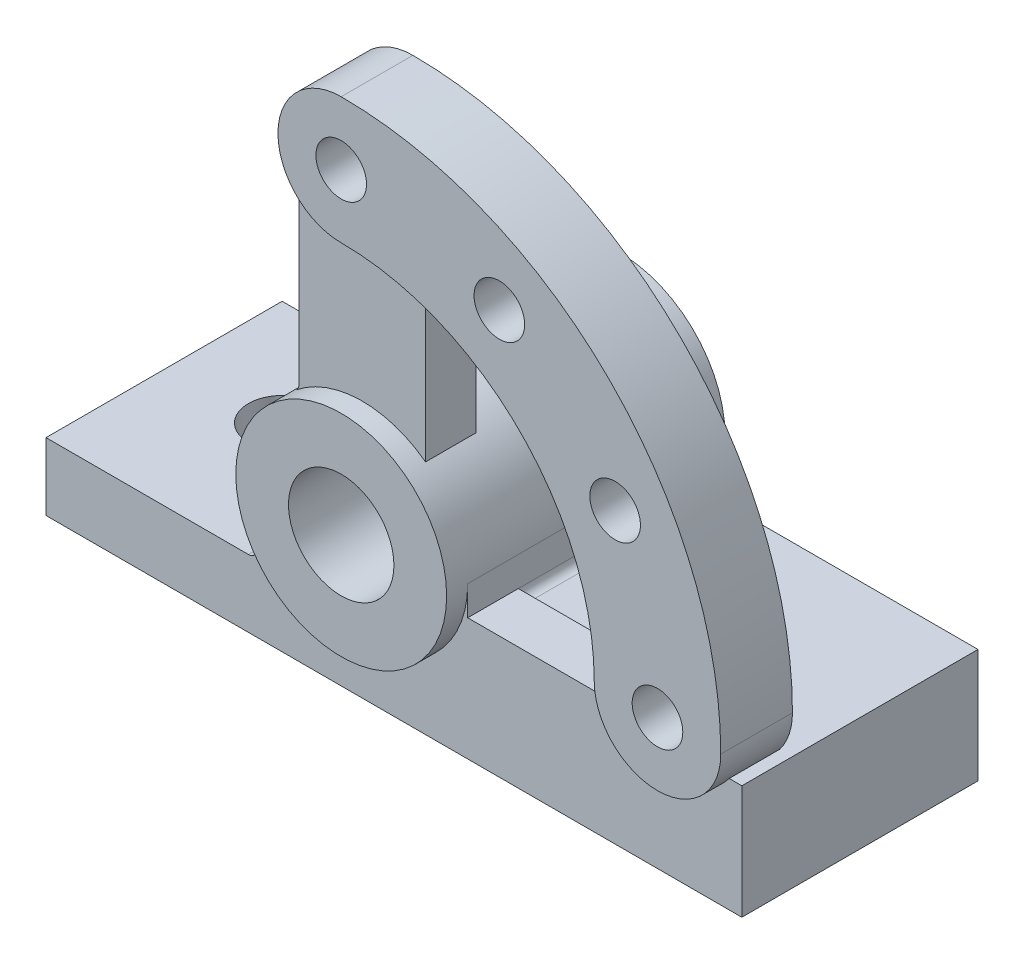
ISO-10303-21;
HEADER;
FILE_DESCRIPTION(('STEP AP214'),'2;1');
FILE_NAME('part.step','',(''),(''),'','','');
FILE_SCHEMA(('AUTOMOTIVE_DESIGN { 1 0 10303 214 1 1 1 1 }'));
ENDSEC;
DATA;
#1=APPLICATION_CONTEXT('core data for automotive mechanical design processes');
#2=APPLICATION_PROTOCOL_DEFINITION('international standard','automotive_design',2000,#1);
#3=PRODUCT_CONTEXT('',#1,'mechanical');
#4=PRODUCT('Part','Part','',(#3));
#5=PRODUCT_RELATED_PRODUCT_CATEGORY('part','',(#4));
#6=PRODUCT_DEFINITION_FORMATION('','',#4);
#7=PRODUCT_DEFINITION_CONTEXT('part definition',#1,'design');
#8=PRODUCT_DEFINITION('design','',#6,#7);
#9=PRODUCT_DEFINITION_SHAPE('','',#8);
#10=(LENGTH_UNIT() NAMED_UNIT(*) SI_UNIT(.MILLI.,.METRE.));
#11=(NAMED_UNIT(*) PLANE_ANGLE_UNIT() SI_UNIT($,.RADIAN.));
#12=(NAMED_UNIT(*) SI_UNIT($,.STERADIAN.) SOLID_ANGLE_UNIT());
#13=UNCERTAINTY_MEASURE_WITH_UNIT(LENGTH_MEASURE(1.E-05),#10,'distance_accuracy_value','');
#14=(GEOMETRIC_REPRESENTATION_CONTEXT(3) GLOBAL_UNCERTAINTY_ASSIGNED_CONTEXT((#13)) GLOBAL_UNIT_ASSIGNED_CONTEXT((#10,
#11,#12)) REPRESENTATION_CONTEXT('',''));
#15=CARTESIAN_POINT('',(0.,0.,0.));
#16=DIRECTION('',(0.,0.,1.));
#17=DIRECTION('',(1.,0.,0.));
#18=AXIS2_PLACEMENT_3D('',#15,#16,#17);
#19=CARTESIAN_POINT('',(27.,-7.00000000000001,-28.));
#20=DIRECTION('',(0.,0.,1.));
#21=DIRECTION('',(1.,0.,0.));
#22=AXIS2_PLACEMENT_3D('',#19,#20,#21);
#23=CYLINDRICAL_SURFACE('',#22,2.);
#24=CARTESIAN_POINT('',(27.,-7.00000000000001,16.));
#25=DIRECTION('',(0.,0.,1.));
#26=DIRECTION('',(1.,0.,0.));
#27=AXIS2_PLACEMENT_3D('',#24,#25,#26);
#28=CIRCLE('',#27,2.);
#29=CARTESIAN_POINT('',(25.,-7.00000000000002,16.));
#30=VERTEX_POINT('',#29);
#31=CARTESIAN_POINT('',(27.,-9.00000000000001,16.));
#32=VERTEX_POINT('',#31);
#33=EDGE_CURVE('E230',#30,#32,#28,.T.);
#34=ORIENTED_EDGE('',*,*,#33,.T.);
#35=DIRECTION('',(0.,0.,1.));
#36=VECTOR('',#35,1.);
#37=CARTESIAN_POINT('',(27.,-9.00000000000001,-28.));
#38=LINE('',#37,#36);
#39=CARTESIAN_POINT('',(27.,-9.00000000000001,-28.));
#40=VERTEX_POINT('',#39);
#41=EDGE_CURVE('E246',#40,#32,#38,.T.);
#42=ORIENTED_EDGE('',*,*,#41,.F.);
#43=CARTESIAN_POINT('',(27.,-7.00000000000001,-28.));
#44=DIRECTION('',(0.,0.,1.));
#45=DIRECTION('',(1.,0.,0.));
#46=AXIS2_PLACEMENT_3D('',#43,#44,#45);
#47=CIRCLE('',#46,2.);
#48=CARTESIAN_POINT('',(25.,-7.,-28.));
#49=VERTEX_POINT('',#48);
#50=EDGE_CURVE('E454',#49,#40,#47,.T.);
#51=ORIENTED_EDGE('',*,*,#50,.F.);
#52=DIRECTION('',(0.,0.,1.));
#53=VECTOR('',#52,1.);
#54=CARTESIAN_POINT('',(25.,-7.,-28.));
#55=LINE('',#54,#53);
#56=EDGE_CURVE('E249',#49,#30,#55,.T.);
#57=ORIENTED_EDGE('',*,*,#56,.T.);
#58=EDGE_LOOP('',(#34,#42,#51,#57));
#59=FACE_BOUND('',#58,.T.);
#60=ADVANCED_FACE('F70',(#59),#23,.F.);
#61=CARTESIAN_POINT('',(27.,-9.00000000000001,-28.));
#62=DIRECTION('',(0.,-1.,0.));
#63=DIRECTION('',(0.,0.,-1.));
#64=AXIS2_PLACEMENT_3D('',#61,#62,#63);
#65=PLANE('',#64);
#66=CARTESIAN_POINT('',(57.5,-9.00000000000001,-3.));
#67=DIRECTION('',(0.,1.,0.));
#68=DIRECTION('',(0.,0.,1.));
#69=AXIS2_PLACEMENT_3D('',#66,#67,#68);
#70=CIRCLE('',#69,8.00000000000001);
#71=CARTESIAN_POINT('',(57.5,-9.00000000000001,5.00000000000001));
#72=VERTEX_POINT('',#71);
#73=EDGE_CURVE('E537',#72,#72,#70,.T.);
#74=ORIENTED_EDGE('',*,*,#73,.F.);
#75=EDGE_LOOP('',(#74));
#76=FACE_BOUND('',#75,.T.);
#77=ORIENTED_EDGE('',*,*,#41,.T.);
#78=DIRECTION('',(-1.,0.,0.));
#79=VECTOR('',#78,1.);
#80=CARTESIAN_POINT('',(27.,-9.00000000000001,16.));
#81=LINE('',#80,#79);
#82=CARTESIAN_POINT('',(87.,-9.00000000000001,16.));
#83=VERTEX_POINT('',#82);
#84=EDGE_CURVE('E224',#83,#32,#81,.T.);
#85=ORIENTED_EDGE('',*,*,#84,.F.);
#86=DIRECTION('',(0.,0.,1.));
#87=VECTOR('',#86,1.);
#88=CARTESIAN_POINT('',(87.,-9.00000000000001,16.));
#89=LINE('',#88,#87);
#90=CARTESIAN_POINT('',(87.,-9.00000000000001,28.));
#91=VERTEX_POINT('',#90);
#92=EDGE_CURVE('E411',#83,#91,#89,.T.);
#93=ORIENTED_EDGE('',*,*,#92,.T.);
#94=DIRECTION('',(1.,0.,0.));
#95=VECTOR('',#94,1.);
#96=CARTESIAN_POINT('',(27.,-9.00000000000001,28.));
#97=LINE('',#96,#95);
#98=CARTESIAN_POINT('',(90.,-9.00000000000001,28.));
#99=VERTEX_POINT('',#98);
#100=EDGE_CURVE('E484',#91,#99,#97,.T.);
#101=ORIENTED_EDGE('',*,*,#100,.T.);
#102=DIRECTION('',(0.,0.,1.));
#103=VECTOR('',#102,1.);
#104=CARTESIAN_POINT('',(90.,-9.00000000000001,-28.));
#105=LINE('',#104,#103);
#106=CARTESIAN_POINT('',(90.,-9.00000000000001,-28.));
#107=VERTEX_POINT('',#106);
#108=EDGE_CURVE('E258',#107,#99,#105,.T.);
#109=ORIENTED_EDGE('',*,*,#108,.F.);
#110=DIRECTION('',(1.,0.,0.));
#111=VECTOR('',#110,1.);
#112=CARTESIAN_POINT('',(27.,-9.00000000000001,-28.));
#113=LINE('',#112,#111);
#114=EDGE_CURVE('E256',#40,#107,#113,.T.);
#115=ORIENTED_EDGE('',*,*,#114,.F.);
#116=EDGE_LOOP('',(#77,#85,#93,#101,#109,#115));
#117=FACE_BOUND('',#116,.T.);
#118=ADVANCED_FACE('F254',(#76,#117),#65,.F.);
#119=CARTESIAN_POINT('',(0.,0.,33.));
#120=DIRECTION('',(0.,0.,-1.));
#121=DIRECTION('',(-1.,0.,0.));
#122=AXIS2_PLACEMENT_3D('',#119,#120,#121);
#123=CYLINDRICAL_SURFACE('',#122,25.);
#124=CARTESIAN_POINT('',(0.,0.,28.));
#125=DIRECTION('',(0.,0.,-1.));
#126=DIRECTION('',(1.,0.,0.));
#127=AXIS2_PLACEMENT_3D('',#124,#125,#126);
#128=CIRCLE('',#127,25.);
#129=CARTESIAN_POINT('',(-15.7407407407407,19.422386077225,28.));
#130=VERTEX_POINT('',#129);
#131=CARTESIAN_POINT('',(15.,20.,28.));
#132=VERTEX_POINT('',#131);
#133=EDGE_CURVE('E86',#130,#132,#128,.T.);
#134=ORIENTED_EDGE('',*,*,#133,.F.);
#135=DIRECTION('',(0.,0.,-1.));
#136=VECTOR('',#135,1.);
#137=CARTESIAN_POINT('',(-15.7407407407407,19.422386077225,33.));
#138=LINE('',#137,#136);
#139=CARTESIAN_POINT('',(-15.7407407407407,19.422386077225,16.));
#140=VERTEX_POINT('',#139);
#141=EDGE_CURVE('E352',#130,#140,#138,.T.);
#142=ORIENTED_EDGE('',*,*,#141,.T.);
#143=CARTESIAN_POINT('',(0.,0.,16.));
#144=DIRECTION('',(0.,0.,-1.));
#145=DIRECTION('',(1.,0.,0.));
#146=AXIS2_PLACEMENT_3D('',#143,#144,#145);
#147=CIRCLE('',#146,25.);
#148=CARTESIAN_POINT('',(15.,20.,16.));
#149=VERTEX_POINT('',#148);
#150=EDGE_CURVE('E93',#140,#149,#147,.T.);
#151=ORIENTED_EDGE('',*,*,#150,.T.);
#152=DIRECTION('',(0.,0.,1.));
#153=VECTOR('',#152,1.);
#154=CARTESIAN_POINT('',(15.,20.,16.));
#155=LINE('',#154,#153);
#156=EDGE_CURVE('E297',#149,#132,#155,.T.);
#157=ORIENTED_EDGE('',*,*,#156,.T.);
#158=EDGE_LOOP('',(#134,#142,#151,#157));
#159=FACE_BOUND('',#158,.T.);
#160=CARTESIAN_POINT('',(0.,0.,33.));
#161=DIRECTION('',(0.,0.,1.));
#162=DIRECTION('',(1.,0.,0.));
#163=AXIS2_PLACEMENT_3D('',#160,#161,#162);
#164=CIRCLE('',#163,25.);
#165=CARTESIAN_POINT('',(25.,0.,33.));
#166=VERTEX_POINT('',#165);
#167=EDGE_CURVE('E339',#166,#166,#164,.T.);
#168=ORIENTED_EDGE('',*,*,#167,.F.);
#169=EDGE_LOOP('',(#168));
#170=FACE_BOUND('',#169,.T.);
#171=CARTESIAN_POINT('',(0.,0.,-33.));
#172=DIRECTION('',(0.,0.,1.));
#173=DIRECTION('',(1.,0.,0.));
#174=AXIS2_PLACEMENT_3D('',#171,#172,#173);
#175=CIRCLE('',#174,25.);
#176=CARTESIAN_POINT('',(25.,0.,-33.));
#177=VERTEX_POINT('',#176);
#178=EDGE_CURVE('E335',#177,#177,#175,.T.);
#179=ORIENTED_EDGE('',*,*,#178,.T.);
#180=EDGE_LOOP('',(#179));
#181=FACE_BOUND('',#180,.T.);
#182=CARTESIAN_POINT('',(0.,0.,-28.));
#183=DIRECTION('',(0.,0.,1.));
#184=DIRECTION('',(1.,0.,0.));
#185=AXIS2_PLACEMENT_3D('',#182,#183,#184);
#186=CIRCLE('',#185,25.);
#187=CARTESIAN_POINT('',(-25.,0.,-28.));
#188=VERTEX_POINT('',#187);
#189=CARTESIAN_POINT('',(25.,0.,-28.));
#190=VERTEX_POINT('',#189);
#191=EDGE_CURVE('E448',#188,#190,#186,.T.);
#192=ORIENTED_EDGE('',*,*,#191,.F.);
#193=DIRECTION('',(0.,0.,1.));
#194=VECTOR('',#193,1.);
#195=CARTESIAN_POINT('',(-25.,0.,-28.));
#196=LINE('',#195,#194);
#197=CARTESIAN_POINT('',(-25.,0.,28.));
#198=VERTEX_POINT('',#197);
#199=EDGE_CURVE('E272',#188,#198,#196,.T.);
#200=ORIENTED_EDGE('',*,*,#199,.T.);
#201=CARTESIAN_POINT('',(0.,0.,28.));
#202=DIRECTION('',(0.,0.,1.));
#203=DIRECTION('',(1.,0.,0.));
#204=AXIS2_PLACEMENT_3D('',#201,#202,#203);
#205=CIRCLE('',#204,25.);
#206=CARTESIAN_POINT('',(25.,0.,28.));
#207=VERTEX_POINT('',#206);
#208=EDGE_CURVE('E476',#198,#207,#205,.T.);
#209=ORIENTED_EDGE('',*,*,#208,.T.);
#210=DIRECTION('',(0.,0.,1.));
#211=VECTOR('',#210,1.);
#212=CARTESIAN_POINT('',(25.,0.,-28.));
#213=LINE('',#212,#211);
#214=EDGE_CURVE('E262',#190,#207,#213,.T.);
#215=ORIENTED_EDGE('',*,*,#214,.F.);
#216=EDGE_LOOP('',(#192,#200,#209,#215));
#217=FACE_BOUND('',#216,.T.);
#218=ADVANCED_FACE('F363',(#159,#170,#181,#217),#123,.T.);
#219=CARTESIAN_POINT('',(0.,0.,33.));
#220=DIRECTION('',(0.,0.,1.));
#221=DIRECTION('',(1.,0.,0.));
#222=AXIS2_PLACEMENT_3D('',#219,#220,#221);
#223=PLANE('',#222);
#224=ORIENTED_EDGE('',*,*,#167,.T.);
#225=EDGE_LOOP('',(#224));
#226=FACE_BOUND('',#225,.T.);
#227=CARTESIAN_POINT('',(0.,0.,33.));
#228=DIRECTION('',(0.,0.,1.));
#229=DIRECTION('',(1.,0.,0.));
#230=AXIS2_PLACEMENT_3D('',#227,#228,#229);
#231=CIRCLE('',#230,12.5);
#232=CARTESIAN_POINT('',(12.5,0.,33.));
#233=VERTEX_POINT('',#232);
#234=EDGE_CURVE('E331',#233,#233,#231,.T.);
#235=ORIENTED_EDGE('',*,*,#234,.F.);
#236=EDGE_LOOP('',(#235));
#237=FACE_BOUND('',#236,.T.);
#238=ADVANCED_FACE('F658',(#226,#237),#223,.T.);
#239=CARTESIAN_POINT('',(0.,0.,-33.));
#240=DIRECTION('',(0.,0.,1.));
#241=DIRECTION('',(1.,0.,0.));
#242=AXIS2_PLACEMENT_3D('',#239,#240,#241);
#243=PLANE('',#242);
#244=ORIENTED_EDGE('',*,*,#178,.F.);
#245=EDGE_LOOP('',(#244));
#246=FACE_BOUND('',#245,.T.);
#247=CARTESIAN_POINT('',(0.,0.,-33.));
#248=DIRECTION('',(0.,0.,1.));
#249=DIRECTION('',(1.,0.,0.));
#250=AXIS2_PLACEMENT_3D('',#247,#248,#249);
#251=CIRCLE('',#250,12.5);
#252=CARTESIAN_POINT('',(12.5,0.,-33.));
#253=VERTEX_POINT('',#252);
#254=EDGE_CURVE('E322',#253,#253,#251,.T.);
#255=ORIENTED_EDGE('',*,*,#254,.T.);
#256=EDGE_LOOP('',(#255));
#257=FACE_BOUND('',#256,.T.);
#258=ADVANCED_FACE('F656',(#246,#257),#243,.F.);
#259=CARTESIAN_POINT('',(0.,0.,33.));
#260=DIRECTION('',(0.,0.,-1.));
#261=DIRECTION('',(-1.,0.,0.));
#262=AXIS2_PLACEMENT_3D('',#259,#260,#261);
#263=CYLINDRICAL_SURFACE('',#262,12.5);
#264=ORIENTED_EDGE('',*,*,#234,.T.);
#265=EDGE_LOOP('',(#264));
#266=FACE_BOUND('',#265,.T.);
#267=ORIENTED_EDGE('',*,*,#254,.F.);
#268=EDGE_LOOP('',(#267));
#269=FACE_BOUND('',#268,.T.);
#270=ADVANCED_FACE('F650',(#266,#269),#263,.F.);
#271=CARTESIAN_POINT('',(15.,58.0947501931113,16.));
#272=DIRECTION('',(1.,0.,0.));
#273=DIRECTION('',(0.,0.,-1.));
#274=AXIS2_PLACEMENT_3D('',#271,#272,#273);
#275=PLANE('',#274);
#276=DIRECTION('',(0.,1.,0.));
#277=VECTOR('',#276,1.);
#278=CARTESIAN_POINT('',(15.,58.0947501931113,28.));
#279=LINE('',#278,#277);
#280=CARTESIAN_POINT('',(15.,58.0947501931113,28.));
#281=VERTEX_POINT('',#280);
#282=EDGE_CURVE('E303',#132,#281,#279,.T.);
#283=ORIENTED_EDGE('',*,*,#282,.F.);
#284=ORIENTED_EDGE('',*,*,#156,.F.);
#285=DIRECTION('',(0.,1.,0.));
#286=VECTOR('',#285,1.);
#287=CARTESIAN_POINT('',(15.,58.0947501931113,16.));
#288=LINE('',#287,#286);
#289=CARTESIAN_POINT('',(15.,58.0947501931113,16.));
#290=VERTEX_POINT('',#289);
#291=EDGE_CURVE('E296',#149,#290,#288,.T.);
#292=ORIENTED_EDGE('',*,*,#291,.T.);
#293=DIRECTION('',(0.,0.,1.));
#294=VECTOR('',#293,1.);
#295=CARTESIAN_POINT('',(15.,58.0947501931113,16.));
#296=LINE('',#295,#294);
#297=EDGE_CURVE('E292',#290,#281,#296,.T.);
#298=ORIENTED_EDGE('',*,*,#297,.T.);
#299=EDGE_LOOP('',(#283,#284,#292,#298));
#300=FACE_BOUND('',#299,.T.);
#301=ADVANCED_FACE('F366',(#300),#275,.T.);
#302=CARTESIAN_POINT('',(-15.,75.,16.));
#303=DIRECTION('',(-1.,0.,0.));
#304=DIRECTION('',(0.,-1.,0.));
#305=AXIS2_PLACEMENT_3D('',#302,#303,#304);
#306=PLANE('',#305);
#307=DIRECTION('',(0.,-1.,0.));
#308=VECTOR('',#307,1.);
#309=CARTESIAN_POINT('',(-15.,75.,16.));
#310=LINE('',#309,#308);
#311=CARTESIAN_POINT('',(-15.,75.,16.));
#312=VERTEX_POINT('',#311);
#313=CARTESIAN_POINT('',(-15.,20.976176963403,16.));
#314=VERTEX_POINT('',#313);
#315=EDGE_CURVE('E307',#312,#314,#310,.T.);
#316=ORIENTED_EDGE('',*,*,#315,.T.);
#317=DIRECTION('',(0.,0.,-1.));
#318=VECTOR('',#317,1.);
#319=CARTESIAN_POINT('',(-15.,20.976176963403,16.));
#320=LINE('',#319,#318);
#321=CARTESIAN_POINT('',(-15.,20.976176963403,28.));
#322=VERTEX_POINT('',#321);
#323=EDGE_CURVE('E239',#314,#322,#320,.F.);
#324=ORIENTED_EDGE('',*,*,#323,.T.);
#325=DIRECTION('',(0.,-1.,0.));
#326=VECTOR('',#325,1.);
#327=CARTESIAN_POINT('',(-15.,75.,28.));
#328=LINE('',#327,#326);
#329=CARTESIAN_POINT('',(-15.,75.,28.));
#330=VERTEX_POINT('',#329);
#331=EDGE_CURVE('E310',#330,#322,#328,.T.);
#332=ORIENTED_EDGE('',*,*,#331,.F.);
#333=DIRECTION('',(0.,0.,1.));
#334=VECTOR('',#333,1.);
#335=CARTESIAN_POINT('',(-15.,75.,16.));
#336=LINE('',#335,#334);
#337=EDGE_CURVE('E293',#312,#330,#336,.T.);
#338=ORIENTED_EDGE('',*,*,#337,.F.);
#339=EDGE_LOOP('',(#316,#324,#332,#338));
#340=FACE_BOUND('',#339,.T.);
#341=ADVANCED_FACE('F645',(#340),#306,.T.);
#342=CARTESIAN_POINT('',(0.,0.,16.));
#343=DIRECTION('',(0.,0.,1.));
#344=DIRECTION('',(1.,0.,0.));
#345=AXIS2_PLACEMENT_3D('',#342,#343,#344);
#346=PLANE('',#345);
#347=ORIENTED_EDGE('',*,*,#315,.F.);
#348=CARTESIAN_POINT('',(0.,75.,16.));
#349=DIRECTION('',(0.,0.,1.));
#350=DIRECTION('',(1.,0.,0.));
#351=AXIS2_PLACEMENT_3D('',#348,#349,#350);
#352=CIRCLE('',#351,15.);
#353=CARTESIAN_POINT('',(0.,90.,16.));
#354=VERTEX_POINT('',#353);
#355=EDGE_CURVE('E392',#354,#312,#352,.T.);
#356=ORIENTED_EDGE('',*,*,#355,.F.);
#357=CARTESIAN_POINT('',(0.,0.,16.));
#358=DIRECTION('',(0.,0.,1.));
#359=DIRECTION('',(1.,0.,0.));
#360=AXIS2_PLACEMENT_3D('',#357,#358,#359);
#361=CIRCLE('',#360,90.);
#362=CARTESIAN_POINT('',(90.,0.,16.));
#363=VERTEX_POINT('',#362);
#364=EDGE_CURVE('E380',#363,#354,#361,.T.);
#365=ORIENTED_EDGE('',*,*,#364,.F.);
#366=CARTESIAN_POINT('',(75.,0.,16.));
#367=DIRECTION('',(0.,0.,1.));
#368=DIRECTION('',(1.,0.,0.));
#369=AXIS2_PLACEMENT_3D('',#366,#367,#368);
#370=CIRCLE('',#369,15.);
#371=EDGE_CURVE('E233',#83,#363,#370,.T.);
#372=ORIENTED_EDGE('',*,*,#371,.F.);
#373=ORIENTED_EDGE('',*,*,#84,.T.);
#374=ORIENTED_EDGE('',*,*,#33,.F.);
#375=DIRECTION('',(-1.,0.,0.));
#376=VECTOR('',#375,1.);
#377=CARTESIAN_POINT('',(25.,-7.00000000000002,16.));
#378=LINE('',#377,#376);
#379=CARTESIAN_POINT('',(58.,-7.00000000000002,16.));
#380=VERTEX_POINT('',#379);
#381=EDGE_CURVE('E540',#380,#30,#378,.T.);
#382=ORIENTED_EDGE('',*,*,#381,.F.);
#383=CARTESIAN_POINT('',(58.,-5.00000000000002,16.));
#384=DIRECTION('',(0.,0.,-1.));
#385=DIRECTION('',(1.,0.,0.));
#386=AXIS2_PLACEMENT_3D('',#383,#384,#385);
#387=CIRCLE('',#386,2.);
#388=CARTESIAN_POINT('',(60.,-5.00000000000002,16.));
#389=VERTEX_POINT('',#388);
#390=EDGE_CURVE('E960',#389,#380,#387,.T.);
#391=ORIENTED_EDGE('',*,*,#390,.F.);
#392=DIRECTION('',(0.,-1.,0.));
#393=VECTOR('',#392,1.);
#394=CARTESIAN_POINT('',(60.,-5.00000000000001,16.));
#395=LINE('',#394,#393);
#396=CARTESIAN_POINT('',(60.,0.,16.));
#397=VERTEX_POINT('',#396);
#398=EDGE_CURVE('E251',#397,#389,#395,.T.);
#399=ORIENTED_EDGE('',*,*,#398,.F.);
#400=CARTESIAN_POINT('',(0.,0.,16.));
#401=DIRECTION('',(0.,0.,1.));
#402=DIRECTION('',(1.,0.,0.));
#403=AXIS2_PLACEMENT_3D('',#400,#401,#402);
#404=CIRCLE('',#403,60.);
#405=EDGE_CURVE('E370',#397,#290,#404,.T.);
#406=ORIENTED_EDGE('',*,*,#405,.T.);
#407=ORIENTED_EDGE('',*,*,#291,.F.);
#408=ORIENTED_EDGE('',*,*,#150,.F.);
#409=CARTESIAN_POINT('',(-17.,20.976176963403,16.));
#410=DIRECTION('',(0.,0.,1.));
#411=DIRECTION('',(1.,0.,0.));
#412=AXIS2_PLACEMENT_3D('',#409,#410,#411);
#413=CIRCLE('',#412,2.);
#414=EDGE_CURVE('E12',#140,#314,#413,.T.);
#415=ORIENTED_EDGE('',*,*,#414,.T.);
#416=EDGE_LOOP('',(#347,#356,#365,#372,#373,#374,#382,#391,#399,#406,#407,#408,#415));
#417=FACE_BOUND('',#416,.T.);
#418=CARTESIAN_POINT('',(0.,75.,16.));
#419=DIRECTION('',(0.,0.,1.));
#420=DIRECTION('',(1.,0.,0.));
#421=AXIS2_PLACEMENT_3D('',#418,#419,#420);
#422=CIRCLE('',#421,6.);
#423=CARTESIAN_POINT('',(6.,75.,16.));
#424=VERTEX_POINT('',#423);
#425=EDGE_CURVE('E401',#424,#424,#422,.T.);
#426=ORIENTED_EDGE('',*,*,#425,.T.);
#427=EDGE_LOOP('',(#426));
#428=FACE_BOUND('',#427,.T.);
#429=CARTESIAN_POINT('',(37.5000000000001,64.9519052838329,16.));
#430=DIRECTION('',(0.,0.,1.));
#431=DIRECTION('',(1.,0.,0.));
#432=AXIS2_PLACEMENT_3D('',#429,#430,#431);
#433=CIRCLE('',#432,6.);
#434=CARTESIAN_POINT('',(43.5000000000001,64.9519052838329,16.));
#435=VERTEX_POINT('',#434);
#436=EDGE_CURVE('E561',#435,#435,#433,.T.);
#437=ORIENTED_EDGE('',*,*,#436,.T.);
#438=EDGE_LOOP('',(#437));
#439=FACE_BOUND('',#438,.T.);
#440=CARTESIAN_POINT('',(64.9519052838329,37.5000000000001,16.));
#441=DIRECTION('',(0.,0.,1.));
#442=DIRECTION('',(1.,0.,0.));
#443=AXIS2_PLACEMENT_3D('',#440,#441,#442);
#444=CIRCLE('',#443,5.99999999999999);
#445=CARTESIAN_POINT('',(70.9519052838329,37.5000000000001,16.));
#446=VERTEX_POINT('',#445);
#447=EDGE_CURVE('E569',#446,#446,#444,.T.);
#448=ORIENTED_EDGE('',*,*,#447,.T.);
#449=EDGE_LOOP('',(#448));
#450=FACE_BOUND('',#449,.T.);
#451=CARTESIAN_POINT('',(75.,0.,16.));
#452=DIRECTION('',(0.,0.,1.));
#453=DIRECTION('',(1.,0.,0.));
#454=AXIS2_PLACEMENT_3D('',#451,#452,#453);
#455=CIRCLE('',#454,6.);
#456=CARTESIAN_POINT('',(81.,0.,16.));
#457=VERTEX_POINT('',#456);
#458=EDGE_CURVE('E576',#457,#457,#455,.T.);
#459=ORIENTED_EDGE('',*,*,#458,.T.);
#460=EDGE_LOOP('',(#459));
#461=FACE_BOUND('',#460,.T.);
#462=ADVANCED_FACE('F227',(#417,#428,#439,#450,#461),#346,.F.);
#463=CARTESIAN_POINT('',(0.,0.,28.));
#464=DIRECTION('',(0.,0.,1.));
#465=DIRECTION('',(1.,0.,0.));
#466=AXIS2_PLACEMENT_3D('',#463,#464,#465);
#467=PLANE('',#466);
#468=CARTESIAN_POINT('',(0.,0.,28.));
#469=DIRECTION('',(0.,0.,1.));
#470=DIRECTION('',(1.,0.,0.));
#471=AXIS2_PLACEMENT_3D('',#468,#469,#470);
#472=CIRCLE('',#471,60.);
#473=CARTESIAN_POINT('',(1.50732877856346E-13,60.,28.));
#474=VERTEX_POINT('',#473);
#475=EDGE_CURVE('E318',#281,#474,#472,.T.);
#476=ORIENTED_EDGE('',*,*,#475,.T.);
#477=CARTESIAN_POINT('',(0.,75.,28.));
#478=DIRECTION('',(0.,0.,-1.));
#479=DIRECTION('',(1.,0.,0.));
#480=AXIS2_PLACEMENT_3D('',#477,#478,#479);
#481=CIRCLE('',#480,15.);
#482=EDGE_CURVE('E314',#474,#330,#481,.T.);
#483=ORIENTED_EDGE('',*,*,#482,.T.);
#484=ORIENTED_EDGE('',*,*,#331,.T.);
#485=CARTESIAN_POINT('',(-17.,20.976176963403,28.));
#486=DIRECTION('',(0.,0.,1.));
#487=DIRECTION('',(1.,0.,0.));
#488=AXIS2_PLACEMENT_3D('',#485,#486,#487);
#489=CIRCLE('',#488,2.);
#490=EDGE_CURVE('E79',#322,#130,#489,.F.);
#491=ORIENTED_EDGE('',*,*,#490,.T.);
#492=ORIENTED_EDGE('',*,*,#133,.T.);
#493=ORIENTED_EDGE('',*,*,#282,.T.);
#494=EDGE_LOOP('',(#476,#483,#484,#491,#492,#493));
#495=FACE_BOUND('',#494,.T.);
#496=ADVANCED_FACE('F357',(#495),#467,.T.);
#497=CARTESIAN_POINT('',(0.,-36.,-28.));
#498=DIRECTION('',(0.,1.,0.));
#499=DIRECTION('',(0.,0.,1.));
#500=AXIS2_PLACEMENT_3D('',#497,#498,#499);
#501=PLANE('',#500);
#502=CARTESIAN_POINT('',(57.5,-36.,-3.));
#503=DIRECTION('',(0.,1.,0.));
#504=DIRECTION('',(0.,0.,1.));
#505=AXIS2_PLACEMENT_3D('',#502,#503,#504);
#506=CIRCLE('',#505,8.00000000000001);
#507=CARTESIAN_POINT('',(57.5,-36.,5.00000000000001));
#508=VERTEX_POINT('',#507);
#509=EDGE_CURVE('E531',#508,#508,#506,.T.);
#510=ORIENTED_EDGE('',*,*,#509,.T.);
#511=EDGE_LOOP('',(#510));
#512=FACE_BOUND('',#511,.T.);
#513=CARTESIAN_POINT('',(-50.,-36.,-3.));
#514=DIRECTION('',(0.,1.,0.));
#515=DIRECTION('',(0.,0.,1.));
#516=AXIS2_PLACEMENT_3D('',#513,#514,#515);
#517=CIRCLE('',#516,8.);
#518=CARTESIAN_POINT('',(-50.,-36.,5.));
#519=VERTEX_POINT('',#518);
#520=EDGE_CURVE('E424',#519,#519,#517,.T.);
#521=ORIENTED_EDGE('',*,*,#520,.T.);
#522=EDGE_LOOP('',(#521));
#523=FACE_BOUND('',#522,.T.);
#524=DIRECTION('',(-1.,0.,0.));
#525=VECTOR('',#524,1.);
#526=CARTESIAN_POINT('',(0.,-36.,28.));
#527=LINE('',#526,#525);
#528=CARTESIAN_POINT('',(90.,-36.,28.));
#529=VERTEX_POINT('',#528);
#530=CARTESIAN_POINT('',(-75.,-36.,28.));
#531=VERTEX_POINT('',#530);
#532=EDGE_CURVE('E428',#529,#531,#527,.T.);
#533=ORIENTED_EDGE('',*,*,#532,.T.);
#534=DIRECTION('',(0.,0.,1.));
#535=VECTOR('',#534,1.);
#536=CARTESIAN_POINT('',(-75.,-36.,-28.));
#537=LINE('',#536,#535);
#538=CARTESIAN_POINT('',(-75.,-36.,-28.));
#539=VERTEX_POINT('',#538);
#540=EDGE_CURVE('E288',#539,#531,#537,.T.);
#541=ORIENTED_EDGE('',*,*,#540,.F.);
#542=DIRECTION('',(-1.,0.,0.));
#543=VECTOR('',#542,1.);
#544=CARTESIAN_POINT('',(0.,-36.,-28.));
#545=LINE('',#544,#543);
#546=CARTESIAN_POINT('',(90.,-36.,-28.));
#547=VERTEX_POINT('',#546);
#548=EDGE_CURVE('E432',#547,#539,#545,.T.);
#549=ORIENTED_EDGE('',*,*,#548,.F.);
#550=DIRECTION('',(0.,0.,1.));
#551=VECTOR('',#550,1.);
#552=CARTESIAN_POINT('',(90.,-36.,-28.));
#553=LINE('',#552,#551);
#554=EDGE_CURVE('E265',#547,#529,#553,.T.);
#555=ORIENTED_EDGE('',*,*,#554,.T.);
#556=EDGE_LOOP('',(#533,#541,#549,#555));
#557=FACE_BOUND('',#556,.T.);
#558=ADVANCED_FACE('F494',(#512,#523,#557),#501,.F.);
#559=CARTESIAN_POINT('',(-75.,-36.,-28.));
#560=DIRECTION('',(1.,0.,0.));
#561=DIRECTION('',(0.,0.,-1.));
#562=AXIS2_PLACEMENT_3D('',#559,#560,#561);
#563=PLANE('',#562);
#564=DIRECTION('',(0.,1.,0.));
#565=VECTOR('',#564,1.);
#566=CARTESIAN_POINT('',(-75.,-36.,28.));
#567=LINE('',#566,#565);
#568=CARTESIAN_POINT('',(-75.,-20.,28.));
#569=VERTEX_POINT('',#568);
#570=EDGE_CURVE('E464',#531,#569,#567,.T.);
#571=ORIENTED_EDGE('',*,*,#570,.T.);
#572=DIRECTION('',(0.,0.,1.));
#573=VECTOR('',#572,1.);
#574=CARTESIAN_POINT('',(-75.,-20.,-28.));
#575=LINE('',#574,#573);
#576=CARTESIAN_POINT('',(-75.,-20.,-28.));
#577=VERTEX_POINT('',#576);
#578=EDGE_CURVE('E284',#577,#569,#575,.T.);
#579=ORIENTED_EDGE('',*,*,#578,.F.);
#580=DIRECTION('',(0.,1.,0.));
#581=VECTOR('',#580,1.);
#582=CARTESIAN_POINT('',(-75.,-36.,-28.));
#583=LINE('',#582,#581);
#584=EDGE_CURVE('E435',#539,#577,#583,.T.);
#585=ORIENTED_EDGE('',*,*,#584,.F.);
#586=ORIENTED_EDGE('',*,*,#540,.T.);
#587=EDGE_LOOP('',(#571,#579,#585,#586));
#588=FACE_BOUND('',#587,.T.);
#589=ADVANCED_FACE('F507',(#588),#563,.F.);
#590=CARTESIAN_POINT('',(-27.,-20.,-28.));
#591=DIRECTION('',(0.,-1.,0.));
#592=DIRECTION('',(0.,0.,-1.));
#593=AXIS2_PLACEMENT_3D('',#590,#591,#592);
#594=PLANE('',#593);
#595=CARTESIAN_POINT('',(-50.,-20.,-3.));
#596=DIRECTION('',(0.,1.,0.));
#597=DIRECTION('',(0.,0.,1.));
#598=AXIS2_PLACEMENT_3D('',#595,#596,#597);
#599=CIRCLE('',#598,8.);
#600=CARTESIAN_POINT('',(-50.,-20.,5.));
#601=VERTEX_POINT('',#600);
#602=EDGE_CURVE('E423',#601,#601,#599,.T.);
#603=ORIENTED_EDGE('',*,*,#602,.F.);
#604=EDGE_LOOP('',(#603));
#605=FACE_BOUND('',#604,.T.);
#606=DIRECTION('',(1.,0.,0.));
#607=VECTOR('',#606,1.);
#608=CARTESIAN_POINT('',(-27.,-20.,28.));
#609=LINE('',#608,#607);
#610=CARTESIAN_POINT('',(-27.,-20.,28.));
#611=VERTEX_POINT('',#610);
#612=EDGE_CURVE('E467',#569,#611,#609,.T.);
#613=ORIENTED_EDGE('',*,*,#612,.T.);
#614=DIRECTION('',(0.,0.,1.));
#615=VECTOR('',#614,1.);
#616=CARTESIAN_POINT('',(-27.,-20.,-28.));
#617=LINE('',#616,#615);
#618=CARTESIAN_POINT('',(-27.,-20.,-28.));
#619=VERTEX_POINT('',#618);
#620=EDGE_CURVE('E280',#619,#611,#617,.T.);
#621=ORIENTED_EDGE('',*,*,#620,.F.);
#622=DIRECTION('',(1.,0.,0.));
#623=VECTOR('',#622,1.);
#624=CARTESIAN_POINT('',(-27.,-20.,-28.));
#625=LINE('',#624,#623);
#626=EDGE_CURVE('E439',#577,#619,#625,.T.);
#627=ORIENTED_EDGE('',*,*,#626,.F.);
#628=ORIENTED_EDGE('',*,*,#578,.T.);
#629=EDGE_LOOP('',(#613,#621,#627,#628));
#630=FACE_BOUND('',#629,.T.);
#631=ADVANCED_FACE('F511',(#605,#630),#594,.F.);
#632=CARTESIAN_POINT('',(-27.,-18.,-28.));
#633=DIRECTION('',(0.,0.,1.));
#634=DIRECTION('',(1.,0.,0.));
#635=AXIS2_PLACEMENT_3D('',#632,#633,#634);
#636=CYLINDRICAL_SURFACE('',#635,2.);
#637=CARTESIAN_POINT('',(-27.,-18.,28.));
#638=DIRECTION('',(0.,0.,1.));
#639=DIRECTION('',(-1.,0.,0.));
#640=AXIS2_PLACEMENT_3D('',#637,#638,#639);
#641=CIRCLE('',#640,2.);
#642=CARTESIAN_POINT('',(-25.,-18.,28.));
#643=VERTEX_POINT('',#642);
#644=EDGE_CURVE('E470',#611,#643,#641,.T.);
#645=ORIENTED_EDGE('',*,*,#644,.T.);
#646=DIRECTION('',(0.,0.,1.));
#647=VECTOR('',#646,1.);
#648=CARTESIAN_POINT('',(-25.,-18.,-28.));
#649=LINE('',#648,#647);
#650=CARTESIAN_POINT('',(-25.,-18.,-28.));
#651=VERTEX_POINT('',#650);
#652=EDGE_CURVE('E276',#651,#643,#649,.T.);
#653=ORIENTED_EDGE('',*,*,#652,.F.);
#654=CARTESIAN_POINT('',(-27.,-18.,-28.));
#655=DIRECTION('',(0.,0.,1.));
#656=DIRECTION('',(-1.,0.,0.));
#657=AXIS2_PLACEMENT_3D('',#654,#655,#656);
#658=CIRCLE('',#657,2.);
#659=EDGE_CURVE('E442',#619,#651,#658,.T.);
#660=ORIENTED_EDGE('',*,*,#659,.F.);
#661=ORIENTED_EDGE('',*,*,#620,.T.);
#662=EDGE_LOOP('',(#645,#653,#660,#661));
#663=FACE_BOUND('',#662,.T.);
#664=ADVANCED_FACE('F632',(#663),#636,.F.);
#665=CARTESIAN_POINT('',(-25.,0.,-28.));
#666=DIRECTION('',(1.,0.,0.));
#667=DIRECTION('',(0.,0.,-1.));
#668=AXIS2_PLACEMENT_3D('',#665,#666,#667);
#669=PLANE('',#668);
#670=DIRECTION('',(0.,1.,0.));
#671=VECTOR('',#670,1.);
#672=CARTESIAN_POINT('',(-25.,0.,28.));
#673=LINE('',#672,#671);
#674=EDGE_CURVE('E473',#643,#198,#673,.T.);
#675=ORIENTED_EDGE('',*,*,#674,.T.);
#676=ORIENTED_EDGE('',*,*,#199,.F.);
#677=DIRECTION('',(0.,1.,0.));
#678=VECTOR('',#677,1.);
#679=CARTESIAN_POINT('',(-25.,0.,-28.));
#680=LINE('',#679,#678);
#681=EDGE_CURVE('E445',#651,#188,#680,.T.);
#682=ORIENTED_EDGE('',*,*,#681,.F.);
#683=ORIENTED_EDGE('',*,*,#652,.T.);
#684=EDGE_LOOP('',(#675,#676,#682,#683));
#685=FACE_BOUND('',#684,.T.);
#686=ADVANCED_FACE('F628',(#685),#669,.F.);
#687=CARTESIAN_POINT('',(25.,0.,-28.));
#688=DIRECTION('',(-1.,0.,0.));
#689=DIRECTION('',(0.,0.,1.));
#690=AXIS2_PLACEMENT_3D('',#687,#688,#689);
#691=PLANE('',#690);
#692=DIRECTION('',(0.,-1.,0.));
#693=VECTOR('',#692,1.);
#694=CARTESIAN_POINT('',(25.,0.,28.));
#695=LINE('',#694,#693);
#696=CARTESIAN_POINT('',(25.,-7.00000000000002,28.));
#697=VERTEX_POINT('',#696);
#698=EDGE_CURVE('E480',#207,#697,#695,.T.);
#699=ORIENTED_EDGE('',*,*,#698,.T.);
#700=DIRECTION('',(0.,0.,1.));
#701=VECTOR('',#700,1.);
#702=CARTESIAN_POINT('',(25.,-7.00000000000002,16.));
#703=LINE('',#702,#701);
#704=EDGE_CURVE('E546',#30,#697,#703,.T.);
#705=ORIENTED_EDGE('',*,*,#704,.F.);
#706=ORIENTED_EDGE('',*,*,#56,.F.);
#707=DIRECTION('',(0.,-1.,0.));
#708=VECTOR('',#707,1.);
#709=CARTESIAN_POINT('',(25.,0.,-28.));
#710=LINE('',#709,#708);
#711=EDGE_CURVE('E451',#190,#49,#710,.T.);
#712=ORIENTED_EDGE('',*,*,#711,.F.);
#713=ORIENTED_EDGE('',*,*,#214,.T.);
#714=EDGE_LOOP('',(#699,#705,#706,#712,#713));
#715=FACE_BOUND('',#714,.T.);
#716=ADVANCED_FACE('F625',(#715),#691,.F.);
#717=CARTESIAN_POINT('',(90.,-36.,-28.));
#718=DIRECTION('',(-1.,0.,0.));
#719=DIRECTION('',(0.,0.,1.));
#720=AXIS2_PLACEMENT_3D('',#717,#718,#719);
#721=PLANE('',#720);
#722=DIRECTION('',(0.,-1.,0.));
#723=VECTOR('',#722,1.);
#724=CARTESIAN_POINT('',(90.,-36.,28.));
#725=LINE('',#724,#723);
#726=EDGE_CURVE('E436',#99,#529,#725,.T.);
#727=ORIENTED_EDGE('',*,*,#726,.T.);
#728=ORIENTED_EDGE('',*,*,#554,.F.);
#729=DIRECTION('',(0.,-1.,0.));
#730=VECTOR('',#729,1.);
#731=CARTESIAN_POINT('',(90.,-36.,-28.));
#732=LINE('',#731,#730);
#733=EDGE_CURVE('E459',#107,#547,#732,.T.);
#734=ORIENTED_EDGE('',*,*,#733,.F.);
#735=ORIENTED_EDGE('',*,*,#108,.T.);
#736=EDGE_LOOP('',(#727,#728,#734,#735));
#737=FACE_BOUND('',#736,.T.);
#738=ADVANCED_FACE('F498',(#737),#721,.F.);
#739=CARTESIAN_POINT('',(27.,-7.00000000000001,-28.));
#740=DIRECTION('',(0.,0.,1.));
#741=DIRECTION('',(1.,0.,0.));
#742=AXIS2_PLACEMENT_3D('',#739,#740,#741);
#743=PLANE('',#742);
#744=ORIENTED_EDGE('',*,*,#548,.T.);
#745=ORIENTED_EDGE('',*,*,#584,.T.);
#746=ORIENTED_EDGE('',*,*,#626,.T.);
#747=ORIENTED_EDGE('',*,*,#659,.T.);
#748=ORIENTED_EDGE('',*,*,#681,.T.);
#749=ORIENTED_EDGE('',*,*,#191,.T.);
#750=ORIENTED_EDGE('',*,*,#711,.T.);
#751=ORIENTED_EDGE('',*,*,#50,.T.);
#752=ORIENTED_EDGE('',*,*,#114,.T.);
#753=ORIENTED_EDGE('',*,*,#733,.T.);
#754=EDGE_LOOP('',(#744,#745,#746,#747,#748,#749,#750,#751,#752,#753));
#755=FACE_BOUND('',#754,.T.);
#756=ADVANCED_FACE('F515',(#755),#743,.F.);
#757=CARTESIAN_POINT('',(27.,-7.00000000000001,28.));
#758=DIRECTION('',(0.,0.,1.));
#759=DIRECTION('',(1.,0.,0.));
#760=AXIS2_PLACEMENT_3D('',#757,#758,#759);
#761=PLANE('',#760);
#762=CARTESIAN_POINT('',(75.,0.,28.));
#763=DIRECTION('',(0.,0.,1.));
#764=DIRECTION('',(1.,0.,0.));
#765=AXIS2_PLACEMENT_3D('',#762,#763,#764);
#766=CIRCLE('',#765,15.);
#767=CARTESIAN_POINT('',(60.,0.,28.));
#768=VERTEX_POINT('',#767);
#769=EDGE_CURVE('E240',#768,#91,#766,.T.);
#770=ORIENTED_EDGE('',*,*,#769,.F.);
#771=DIRECTION('',(0.,-1.,0.));
#772=VECTOR('',#771,1.);
#773=CARTESIAN_POINT('',(60.,-5.00000000000001,28.));
#774=LINE('',#773,#772);
#775=CARTESIAN_POINT('',(60.,-5.00000000000002,28.));
#776=VERTEX_POINT('',#775);
#777=EDGE_CURVE('E524',#768,#776,#774,.T.);
#778=ORIENTED_EDGE('',*,*,#777,.T.);
#779=CARTESIAN_POINT('',(58.,-5.00000000000002,28.));
#780=DIRECTION('',(0.,0.,-1.));
#781=DIRECTION('',(1.,0.,0.));
#782=AXIS2_PLACEMENT_3D('',#779,#780,#781);
#783=CIRCLE('',#782,2.);
#784=CARTESIAN_POINT('',(58.,-7.00000000000002,28.));
#785=VERTEX_POINT('',#784);
#786=EDGE_CURVE('E530',#776,#785,#783,.T.);
#787=ORIENTED_EDGE('',*,*,#786,.T.);
#788=DIRECTION('',(-1.,0.,0.));
#789=VECTOR('',#788,1.);
#790=CARTESIAN_POINT('',(25.,-7.00000000000002,28.));
#791=LINE('',#790,#789);
#792=EDGE_CURVE('E252',#785,#697,#791,.T.);
#793=ORIENTED_EDGE('',*,*,#792,.T.);
#794=ORIENTED_EDGE('',*,*,#698,.F.);
#795=ORIENTED_EDGE('',*,*,#208,.F.);
#796=ORIENTED_EDGE('',*,*,#674,.F.);
#797=ORIENTED_EDGE('',*,*,#644,.F.);
#798=ORIENTED_EDGE('',*,*,#612,.F.);
#799=ORIENTED_EDGE('',*,*,#570,.F.);
#800=ORIENTED_EDGE('',*,*,#532,.F.);
#801=ORIENTED_EDGE('',*,*,#726,.F.);
#802=ORIENTED_EDGE('',*,*,#100,.F.);
#803=EDGE_LOOP('',(#770,#778,#787,#793,#794,#795,#796,#797,#798,#799,#800,#801,#802));
#804=FACE_BOUND('',#803,.T.);
#805=ADVANCED_FACE('F501',(#804),#761,.T.);
#806=CARTESIAN_POINT('',(-50.,-36.,-3.));
#807=DIRECTION('',(0.,1.,0.));
#808=DIRECTION('',(0.,0.,1.));
#809=AXIS2_PLACEMENT_3D('',#806,#807,#808);
#810=CYLINDRICAL_SURFACE('',#809,8.);
#811=ORIENTED_EDGE('',*,*,#520,.F.);
#812=EDGE_LOOP('',(#811));
#813=FACE_BOUND('',#812,.T.);
#814=ORIENTED_EDGE('',*,*,#602,.T.);
#815=EDGE_LOOP('',(#814));
#816=FACE_BOUND('',#815,.T.);
#817=ADVANCED_FACE('F740',(#813,#816),#810,.F.);
#818=CARTESIAN_POINT('',(75.,0.,16.));
#819=DIRECTION('',(0.,0.,1.));
#820=DIRECTION('',(1.,0.,0.));
#821=AXIS2_PLACEMENT_3D('',#818,#819,#820);
#822=CYLINDRICAL_SURFACE('',#821,15.);
#823=DIRECTION('',(0.,0.,1.));
#824=VECTOR('',#823,1.);
#825=CARTESIAN_POINT('',(60.,0.,16.));
#826=LINE('',#825,#824);
#827=CARTESIAN_POINT('',(60.,0.,33.));
#828=VERTEX_POINT('',#827);
#829=EDGE_CURVE('E395',#768,#828,#826,.T.);
#830=ORIENTED_EDGE('',*,*,#829,.F.);
#831=ORIENTED_EDGE('',*,*,#769,.T.);
#832=ORIENTED_EDGE('',*,*,#92,.F.);
#833=ORIENTED_EDGE('',*,*,#371,.T.);
#834=DIRECTION('',(0.,0.,1.));
#835=VECTOR('',#834,1.);
#836=CARTESIAN_POINT('',(90.,0.,16.));
#837=LINE('',#836,#835);
#838=CARTESIAN_POINT('',(90.,0.,33.));
#839=VERTEX_POINT('',#838);
#840=EDGE_CURVE('E415',#363,#839,#837,.T.);
#841=ORIENTED_EDGE('',*,*,#840,.T.);
#842=CARTESIAN_POINT('',(75.,0.,33.));
#843=DIRECTION('',(0.,0.,1.));
#844=DIRECTION('',(1.,0.,0.));
#845=AXIS2_PLACEMENT_3D('',#842,#843,#844);
#846=CIRCLE('',#845,15.);
#847=EDGE_CURVE('E400',#828,#839,#846,.T.);
#848=ORIENTED_EDGE('',*,*,#847,.F.);
#849=EDGE_LOOP('',(#830,#831,#832,#833,#841,#848));
#850=FACE_BOUND('',#849,.T.);
#851=ADVANCED_FACE('F519',(#850),#822,.T.);
#852=CARTESIAN_POINT('',(0.,0.,33.));
#853=DIRECTION('',(0.,0.,1.));
#854=DIRECTION('',(1.,0.,0.));
#855=AXIS2_PLACEMENT_3D('',#852,#853,#854);
#856=PLANE('',#855);
#857=CARTESIAN_POINT('',(0.,75.,33.));
#858=DIRECTION('',(0.,0.,1.));
#859=DIRECTION('',(1.,0.,0.));
#860=AXIS2_PLACEMENT_3D('',#857,#858,#859);
#861=CIRCLE('',#860,6.);
#862=CARTESIAN_POINT('',(6.,75.,33.));
#863=VERTEX_POINT('',#862);
#864=EDGE_CURVE('E557',#863,#863,#861,.T.);
#865=ORIENTED_EDGE('',*,*,#864,.F.);
#866=EDGE_LOOP('',(#865));
#867=FACE_BOUND('',#866,.T.);
#868=CARTESIAN_POINT('',(37.5000000000001,64.9519052838329,33.));
#869=DIRECTION('',(0.,0.,1.));
#870=DIRECTION('',(1.,0.,0.));
#871=AXIS2_PLACEMENT_3D('',#868,#869,#870);
#872=CIRCLE('',#871,6.);
#873=CARTESIAN_POINT('',(43.5000000000001,64.9519052838329,33.));
#874=VERTEX_POINT('',#873);
#875=EDGE_CURVE('E565',#874,#874,#872,.T.);
#876=ORIENTED_EDGE('',*,*,#875,.F.);
#877=EDGE_LOOP('',(#876));
#878=FACE_BOUND('',#877,.T.);
#879=CARTESIAN_POINT('',(64.9519052838329,37.5000000000001,33.));
#880=DIRECTION('',(0.,0.,1.));
#881=DIRECTION('',(1.,0.,0.));
#882=AXIS2_PLACEMENT_3D('',#879,#880,#881);
#883=CIRCLE('',#882,5.99999999999999);
#884=CARTESIAN_POINT('',(70.9519052838329,37.5000000000001,33.));
#885=VERTEX_POINT('',#884);
#886=EDGE_CURVE('E573',#885,#885,#883,.T.);
#887=ORIENTED_EDGE('',*,*,#886,.F.);
#888=EDGE_LOOP('',(#887));
#889=FACE_BOUND('',#888,.T.);
#890=CARTESIAN_POINT('',(75.,0.,33.));
#891=DIRECTION('',(0.,0.,1.));
#892=DIRECTION('',(1.,0.,0.));
#893=AXIS2_PLACEMENT_3D('',#890,#891,#892);
#894=CIRCLE('',#893,6.);
#895=CARTESIAN_POINT('',(81.,0.,33.));
#896=VERTEX_POINT('',#895);
#897=EDGE_CURVE('E386',#896,#896,#894,.T.);
#898=ORIENTED_EDGE('',*,*,#897,.F.);
#899=EDGE_LOOP('',(#898));
#900=FACE_BOUND('',#899,.T.);
#901=CARTESIAN_POINT('',(0.,0.,33.));
#902=DIRECTION('',(0.,0.,1.));
#903=DIRECTION('',(1.,0.,0.));
#904=AXIS2_PLACEMENT_3D('',#901,#902,#903);
#905=CIRCLE('',#904,60.);
#906=CARTESIAN_POINT('',(0.,60.,33.));
#907=VERTEX_POINT('',#906);
#908=EDGE_CURVE('E396',#828,#907,#905,.T.);
#909=ORIENTED_EDGE('',*,*,#908,.F.);
#910=ORIENTED_EDGE('',*,*,#847,.T.);
#911=CARTESIAN_POINT('',(0.,0.,33.));
#912=DIRECTION('',(0.,0.,1.));
#913=DIRECTION('',(1.,0.,0.));
#914=AXIS2_PLACEMENT_3D('',#911,#912,#913);
#915=CIRCLE('',#914,90.);
#916=CARTESIAN_POINT('',(0.,90.,33.));
#917=VERTEX_POINT('',#916);
#918=EDGE_CURVE('E383',#839,#917,#915,.T.);
#919=ORIENTED_EDGE('',*,*,#918,.T.);
#920=CARTESIAN_POINT('',(0.,75.,33.));
#921=DIRECTION('',(0.,0.,1.));
#922=DIRECTION('',(1.,0.,0.));
#923=AXIS2_PLACEMENT_3D('',#920,#921,#922);
#924=CIRCLE('',#923,15.);
#925=EDGE_CURVE('E376',#917,#907,#924,.T.);
#926=ORIENTED_EDGE('',*,*,#925,.T.);
#927=EDGE_LOOP('',(#909,#910,#919,#926));
#928=FACE_BOUND('',#927,.T.);
#929=ADVANCED_FACE('F587',(#867,#878,#889,#900,#928),#856,.T.);
#930=CARTESIAN_POINT('',(0.,0.,16.));
#931=DIRECTION('',(0.,0.,1.));
#932=DIRECTION('',(1.,0.,0.));
#933=AXIS2_PLACEMENT_3D('',#930,#931,#932);
#934=CYLINDRICAL_SURFACE('',#933,90.);
#935=ORIENTED_EDGE('',*,*,#918,.F.);
#936=ORIENTED_EDGE('',*,*,#840,.F.);
#937=ORIENTED_EDGE('',*,*,#364,.T.);
#938=DIRECTION('',(0.,0.,1.));
#939=VECTOR('',#938,1.);
#940=CARTESIAN_POINT('',(0.,90.,16.));
#941=LINE('',#940,#939);
#942=EDGE_CURVE('E412',#354,#917,#941,.T.);
#943=ORIENTED_EDGE('',*,*,#942,.T.);
#944=EDGE_LOOP('',(#935,#936,#937,#943));
#945=FACE_BOUND('',#944,.T.);
#946=ADVANCED_FACE('F590',(#945),#934,.T.);
#947=CARTESIAN_POINT('',(0.,75.,16.));
#948=DIRECTION('',(0.,0.,1.));
#949=DIRECTION('',(1.,0.,0.));
#950=AXIS2_PLACEMENT_3D('',#947,#948,#949);
#951=CYLINDRICAL_SURFACE('',#950,15.);
#952=ORIENTED_EDGE('',*,*,#355,.T.);
#953=ORIENTED_EDGE('',*,*,#337,.T.);
#954=ORIENTED_EDGE('',*,*,#482,.F.);
#955=DIRECTION('',(0.,0.,1.));
#956=VECTOR('',#955,1.);
#957=CARTESIAN_POINT('',(0.,60.,16.));
#958=LINE('',#957,#956);
#959=EDGE_CURVE('E408',#474,#907,#958,.T.);
#960=ORIENTED_EDGE('',*,*,#959,.T.);
#961=ORIENTED_EDGE('',*,*,#925,.F.);
#962=ORIENTED_EDGE('',*,*,#942,.F.);
#963=EDGE_LOOP('',(#952,#953,#954,#960,#961,#962));
#964=FACE_BOUND('',#963,.T.);
#965=ADVANCED_FACE('F599',(#964),#951,.T.);
#966=CARTESIAN_POINT('',(0.,0.,16.));
#967=DIRECTION('',(0.,0.,1.));
#968=DIRECTION('',(1.,0.,0.));
#969=AXIS2_PLACEMENT_3D('',#966,#967,#968);
#970=CYLINDRICAL_SURFACE('',#969,60.);
#971=ORIENTED_EDGE('',*,*,#297,.F.);
#972=ORIENTED_EDGE('',*,*,#405,.F.);
#973=EDGE_CURVE('E418',#397,#768,#826,.T.);
#974=ORIENTED_EDGE('',*,*,#973,.T.);
#975=ORIENTED_EDGE('',*,*,#829,.T.);
#976=ORIENTED_EDGE('',*,*,#908,.T.);
#977=ORIENTED_EDGE('',*,*,#959,.F.);
#978=ORIENTED_EDGE('',*,*,#475,.F.);
#979=EDGE_LOOP('',(#971,#972,#974,#975,#976,#977,#978));
#980=FACE_BOUND('',#979,.T.);
#981=ADVANCED_FACE('F601',(#980),#970,.F.);
#982=CARTESIAN_POINT('',(75.,0.,16.));
#983=DIRECTION('',(0.,0.,1.));
#984=DIRECTION('',(1.,0.,0.));
#985=AXIS2_PLACEMENT_3D('',#982,#983,#984);
#986=CYLINDRICAL_SURFACE('',#985,6.);
#987=ORIENTED_EDGE('',*,*,#458,.F.);
#988=EDGE_LOOP('',(#987));
#989=FACE_BOUND('',#988,.T.);
#990=ORIENTED_EDGE('',*,*,#897,.T.);
#991=EDGE_LOOP('',(#990));
#992=FACE_BOUND('',#991,.T.);
#993=ADVANCED_FACE('F585',(#989,#992),#986,.F.);
#994=CARTESIAN_POINT('',(64.9519052838329,37.5000000000001,16.));
#995=DIRECTION('',(0.,0.,1.));
#996=DIRECTION('',(1.,0.,0.));
#997=AXIS2_PLACEMENT_3D('',#994,#995,#996);
#998=CYLINDRICAL_SURFACE('',#997,5.99999999999999);
#999=ORIENTED_EDGE('',*,*,#447,.F.);
#1000=EDGE_LOOP('',(#999));
#1001=FACE_BOUND('',#1000,.T.);
#1002=ORIENTED_EDGE('',*,*,#886,.T.);
#1003=EDGE_LOOP('',(#1002));
#1004=FACE_BOUND('',#1003,.T.);
#1005=ADVANCED_FACE('F608',(#1001,#1004),#998,.F.);
#1006=CARTESIAN_POINT('',(37.5000000000001,64.9519052838329,16.));
#1007=DIRECTION('',(0.,0.,1.));
#1008=DIRECTION('',(1.,0.,0.));
#1009=AXIS2_PLACEMENT_3D('',#1006,#1007,#1008);
#1010=CYLINDRICAL_SURFACE('',#1009,6.);
#1011=ORIENTED_EDGE('',*,*,#436,.F.);
#1012=EDGE_LOOP('',(#1011));
#1013=FACE_BOUND('',#1012,.T.);
#1014=ORIENTED_EDGE('',*,*,#875,.T.);
#1015=EDGE_LOOP('',(#1014));
#1016=FACE_BOUND('',#1015,.T.);
#1017=ADVANCED_FACE('F796',(#1013,#1016),#1010,.F.);
#1018=CARTESIAN_POINT('',(0.,75.,16.));
#1019=DIRECTION('',(0.,0.,1.));
#1020=DIRECTION('',(1.,0.,0.));
#1021=AXIS2_PLACEMENT_3D('',#1018,#1019,#1020);
#1022=CYLINDRICAL_SURFACE('',#1021,6.);
#1023=ORIENTED_EDGE('',*,*,#425,.F.);
#1024=EDGE_LOOP('',(#1023));
#1025=FACE_BOUND('',#1024,.T.);
#1026=ORIENTED_EDGE('',*,*,#864,.T.);
#1027=EDGE_LOOP('',(#1026));
#1028=FACE_BOUND('',#1027,.T.);
#1029=ADVANCED_FACE('F730',(#1025,#1028),#1022,.F.);
#1030=CARTESIAN_POINT('',(25.,-7.00000000000002,16.));
#1031=DIRECTION('',(0.,1.,0.));
#1032=DIRECTION('',(0.,0.,1.));
#1033=AXIS2_PLACEMENT_3D('',#1030,#1031,#1032);
#1034=PLANE('',#1033);
#1035=ORIENTED_EDGE('',*,*,#792,.F.);
#1036=DIRECTION('',(0.,0.,1.));
#1037=VECTOR('',#1036,1.);
#1038=CARTESIAN_POINT('',(58.,-7.00000000000002,16.));
#1039=LINE('',#1038,#1037);
#1040=EDGE_CURVE('E549',#380,#785,#1039,.T.);
#1041=ORIENTED_EDGE('',*,*,#1040,.F.);
#1042=ORIENTED_EDGE('',*,*,#381,.T.);
#1043=ORIENTED_EDGE('',*,*,#704,.T.);
#1044=EDGE_LOOP('',(#1035,#1041,#1042,#1043));
#1045=FACE_BOUND('',#1044,.T.);
#1046=ADVANCED_FACE('F721',(#1045),#1034,.T.);
#1047=CARTESIAN_POINT('',(58.,-5.00000000000002,16.));
#1048=DIRECTION('',(0.,0.,1.));
#1049=DIRECTION('',(1.,0.,0.));
#1050=AXIS2_PLACEMENT_3D('',#1047,#1048,#1049);
#1051=CYLINDRICAL_SURFACE('',#1050,2.);
#1052=ORIENTED_EDGE('',*,*,#786,.F.);
#1053=DIRECTION('',(0.,0.,1.));
#1054=VECTOR('',#1053,1.);
#1055=CARTESIAN_POINT('',(60.,-5.00000000000002,16.));
#1056=LINE('',#1055,#1054);
#1057=EDGE_CURVE('E527',#389,#776,#1056,.T.);
#1058=ORIENTED_EDGE('',*,*,#1057,.F.);
#1059=ORIENTED_EDGE('',*,*,#390,.T.);
#1060=ORIENTED_EDGE('',*,*,#1040,.T.);
#1061=EDGE_LOOP('',(#1052,#1058,#1059,#1060));
#1062=FACE_BOUND('',#1061,.T.);
#1063=ADVANCED_FACE('F712',(#1062),#1051,.F.);
#1064=CARTESIAN_POINT('',(60.,-5.00000000000001,16.));
#1065=DIRECTION('',(-1.,0.,0.));
#1066=DIRECTION('',(0.,0.,1.));
#1067=AXIS2_PLACEMENT_3D('',#1064,#1065,#1066);
#1068=PLANE('',#1067);
#1069=ORIENTED_EDGE('',*,*,#777,.F.);
#1070=ORIENTED_EDGE('',*,*,#973,.F.);
#1071=ORIENTED_EDGE('',*,*,#398,.T.);
#1072=ORIENTED_EDGE('',*,*,#1057,.T.);
#1073=EDGE_LOOP('',(#1069,#1070,#1071,#1072));
#1074=FACE_BOUND('',#1073,.T.);
#1075=ADVANCED_FACE('F526',(#1074),#1068,.T.);
#1076=CARTESIAN_POINT('',(57.5,-36.,-3.));
#1077=DIRECTION('',(0.,1.,0.));
#1078=DIRECTION('',(0.,0.,1.));
#1079=AXIS2_PLACEMENT_3D('',#1076,#1077,#1078);
#1080=CYLINDRICAL_SURFACE('',#1079,8.00000000000001);
#1081=ORIENTED_EDGE('',*,*,#509,.F.);
#1082=EDGE_LOOP('',(#1081));
#1083=FACE_BOUND('',#1082,.T.);
#1084=ORIENTED_EDGE('',*,*,#73,.T.);
#1085=EDGE_LOOP('',(#1084));
#1086=FACE_BOUND('',#1085,.T.);
#1087=ADVANCED_FACE('F673',(#1083,#1086),#1080,.F.);
#1088=CARTESIAN_POINT('',(-17.,20.976176963403,33.));
#1089=DIRECTION('',(0.,0.,-1.));
#1090=DIRECTION('',(-1.,0.,0.));
#1091=AXIS2_PLACEMENT_3D('',#1088,#1089,#1090);
#1092=CYLINDRICAL_SURFACE('',#1091,2.);
#1093=ORIENTED_EDGE('',*,*,#414,.F.);
#1094=ORIENTED_EDGE('',*,*,#141,.F.);
#1095=ORIENTED_EDGE('',*,*,#490,.F.);
#1096=ORIENTED_EDGE('',*,*,#323,.F.);
#1097=EDGE_LOOP('',(#1093,#1094,#1095,#1096));
#1098=FACE_BOUND('',#1097,.T.);
#1099=ADVANCED_FACE('F72',(#1098),#1092,.F.);
#1100=CLOSED_SHELL('',(#60,#118,#218,#238,#258,#270,#301,#341,#462,#496,#558,#589,#631,#664,
#686,#716,#738,#756,#805,#817,#851,#929,#946,#965,#981,#993,#1005,#1017,#1029,#1046,#1063,#1075,
#1087,#1099));
#1101=MANIFOLD_SOLID_BREP('B2',#1100);
#1102=ADVANCED_BREP_SHAPE_REPRESENTATION('',(#18,#1101),#14);
#1103=SHAPE_DEFINITION_REPRESENTATION(#9,#1102);
ENDSEC;
END-ISO-10303-21;
